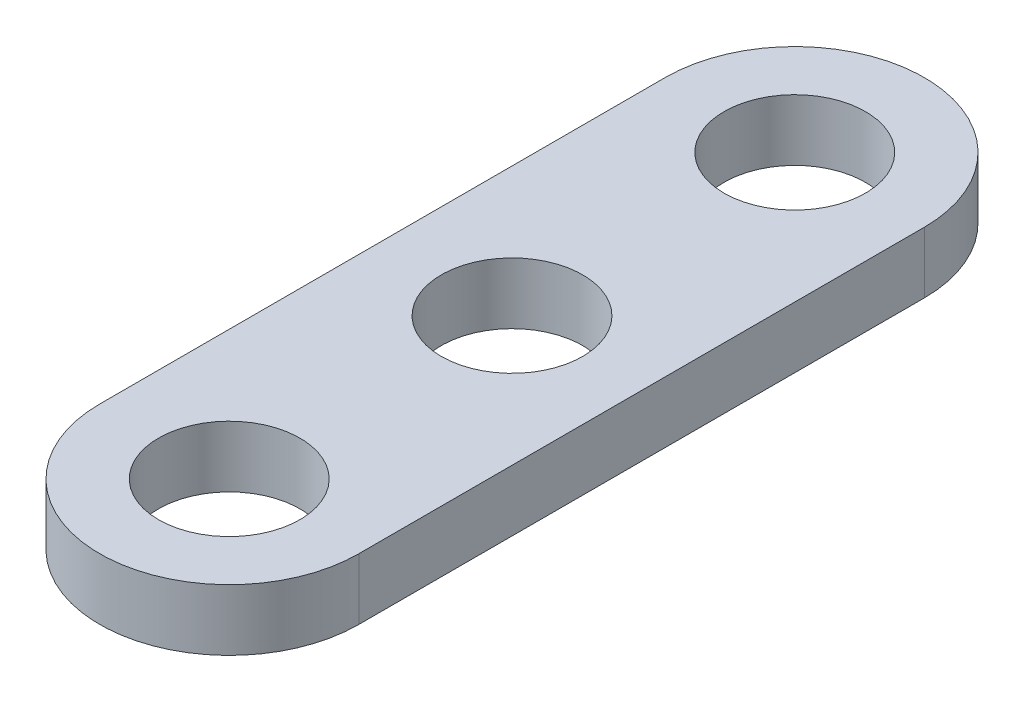
ISO-10303-21;
HEADER;
FILE_DESCRIPTION(('STEP AP214'),'2;1');
FILE_NAME('part.step','',(''),(''),'','','');
FILE_SCHEMA(('AUTOMOTIVE_DESIGN { 1 0 10303 214 1 1 1 1 }'));
ENDSEC;
DATA;
#1=APPLICATION_CONTEXT('core data for automotive mechanical design processes');
#2=APPLICATION_PROTOCOL_DEFINITION('international standard','automotive_design',2000,#1);
#3=PRODUCT_CONTEXT('',#1,'mechanical');
#4=PRODUCT('Part','Part','',(#3));
#5=PRODUCT_RELATED_PRODUCT_CATEGORY('part','',(#4));
#6=PRODUCT_DEFINITION_FORMATION('','',#4);
#7=PRODUCT_DEFINITION_CONTEXT('part definition',#1,'design');
#8=PRODUCT_DEFINITION('design','',#6,#7);
#9=PRODUCT_DEFINITION_SHAPE('','',#8);
#10=(LENGTH_UNIT() NAMED_UNIT(*) SI_UNIT(.MILLI.,.METRE.));
#11=(NAMED_UNIT(*) PLANE_ANGLE_UNIT() SI_UNIT($,.RADIAN.));
#12=(NAMED_UNIT(*) SI_UNIT($,.STERADIAN.) SOLID_ANGLE_UNIT());
#13=UNCERTAINTY_MEASURE_WITH_UNIT(LENGTH_MEASURE(1.E-05),#10,'distance_accuracy_value','');
#14=(GEOMETRIC_REPRESENTATION_CONTEXT(3) GLOBAL_UNCERTAINTY_ASSIGNED_CONTEXT((#13)) GLOBAL_UNIT_ASSIGNED_CONTEXT((#10,
#11,#12)) REPRESENTATION_CONTEXT('',''));
#15=CARTESIAN_POINT('',(0.,0.,0.));
#16=DIRECTION('',(0.,0.,1.));
#17=DIRECTION('',(1.,0.,0.));
#18=AXIS2_PLACEMENT_3D('',#15,#16,#17);
#19=CARTESIAN_POINT('',(0.,2.6,12.));
#20=DIRECTION('',(0.,1.,0.));
#21=DIRECTION('',(0.,0.,1.));
#22=AXIS2_PLACEMENT_3D('',#19,#20,#21);
#23=PLANE('',#22);
#24=CARTESIAN_POINT('',(0.,2.6,12.));
#25=DIRECTION('',(0.,1.,0.));
#26=DIRECTION('',(0.,0.,1.));
#27=AXIS2_PLACEMENT_3D('',#24,#25,#26);
#28=CIRCLE('',#27,3.);
#29=CARTESIAN_POINT('',(0.,2.6,15.));
#30=VERTEX_POINT('',#29);
#31=EDGE_CURVE('E136',#30,#30,#28,.T.);
#32=ORIENTED_EDGE('',*,*,#31,.F.);
#33=EDGE_LOOP('',(#32));
#34=FACE_BOUND('',#33,.T.);
#35=CARTESIAN_POINT('',(0.,2.6,12.));
#36=DIRECTION('',(0.,1.,0.));
#37=DIRECTION('',(0.,0.,1.));
#38=AXIS2_PLACEMENT_3D('',#35,#36,#37);
#39=CIRCLE('',#38,5.5);
#40=CARTESIAN_POINT('',(-5.5,2.6,12.));
#41=VERTEX_POINT('',#40);
#42=CARTESIAN_POINT('',(5.5,2.6,12.));
#43=VERTEX_POINT('',#42);
#44=EDGE_CURVE('E98',#41,#43,#39,.T.);
#45=ORIENTED_EDGE('',*,*,#44,.T.);
#46=DIRECTION('',(0.,0.,-1.));
#47=VECTOR('',#46,1.);
#48=CARTESIAN_POINT('',(5.5,2.6,12.));
#49=LINE('',#48,#47);
#50=CARTESIAN_POINT('',(5.49999999999999,2.6,-12.));
#51=VERTEX_POINT('',#50);
#52=EDGE_CURVE('E91',#43,#51,#49,.T.);
#53=ORIENTED_EDGE('',*,*,#52,.T.);
#54=CARTESIAN_POINT('',(0.,2.6,-12.));
#55=DIRECTION('',(0.,1.,0.));
#56=DIRECTION('',(0.,0.,1.));
#57=AXIS2_PLACEMENT_3D('',#54,#55,#56);
#58=CIRCLE('',#57,5.49999999999999);
#59=CARTESIAN_POINT('',(-5.49999999999999,2.6,-12.));
#60=VERTEX_POINT('',#59);
#61=EDGE_CURVE('E96',#51,#60,#58,.T.);
#62=ORIENTED_EDGE('',*,*,#61,.T.);
#63=DIRECTION('',(0.,0.,1.));
#64=VECTOR('',#63,1.);
#65=CARTESIAN_POINT('',(-5.5,2.6,12.));
#66=LINE('',#65,#64);
#67=EDGE_CURVE('E62',#60,#41,#66,.T.);
#68=ORIENTED_EDGE('',*,*,#67,.T.);
#69=EDGE_LOOP('',(#45,#53,#62,#68));
#70=FACE_BOUND('',#69,.T.);
#71=CARTESIAN_POINT('',(0.,2.6,-12.));
#72=DIRECTION('',(0.,1.,0.));
#73=DIRECTION('',(0.,0.,1.));
#74=AXIS2_PLACEMENT_3D('',#71,#72,#73);
#75=CIRCLE('',#74,3.);
#76=CARTESIAN_POINT('',(0.,2.6,-9.));
#77=VERTEX_POINT('',#76);
#78=EDGE_CURVE('E117',#77,#77,#75,.T.);
#79=ORIENTED_EDGE('',*,*,#78,.F.);
#80=EDGE_LOOP('',(#79));
#81=FACE_BOUND('',#80,.T.);
#82=CARTESIAN_POINT('',(0.,2.6,0.));
#83=DIRECTION('',(0.,1.,0.));
#84=DIRECTION('',(0.,0.,1.));
#85=AXIS2_PLACEMENT_3D('',#82,#83,#84);
#86=CIRCLE('',#85,3.);
#87=CARTESIAN_POINT('',(0.,2.6,3.));
#88=VERTEX_POINT('',#87);
#89=EDGE_CURVE('E146',#88,#88,#86,.T.);
#90=ORIENTED_EDGE('',*,*,#89,.F.);
#91=EDGE_LOOP('',(#90));
#92=FACE_BOUND('',#91,.T.);
#93=ADVANCED_FACE('F44',(#34,#70,#81,#92),#23,.T.);
#94=CARTESIAN_POINT('',(0.,0.,12.));
#95=DIRECTION('',(0.,1.,0.));
#96=DIRECTION('',(0.,0.,1.));
#97=AXIS2_PLACEMENT_3D('',#94,#95,#96);
#98=PLANE('',#97);
#99=CARTESIAN_POINT('',(0.,0.,12.));
#100=DIRECTION('',(0.,1.,0.));
#101=DIRECTION('',(0.,0.,1.));
#102=AXIS2_PLACEMENT_3D('',#99,#100,#101);
#103=CIRCLE('',#102,5.5);
#104=CARTESIAN_POINT('',(-5.5,0.,12.));
#105=VERTEX_POINT('',#104);
#106=CARTESIAN_POINT('',(5.5,0.,12.));
#107=VERTEX_POINT('',#106);
#108=EDGE_CURVE('E111',#105,#107,#103,.T.);
#109=ORIENTED_EDGE('',*,*,#108,.F.);
#110=DIRECTION('',(0.,0.,1.));
#111=VECTOR('',#110,1.);
#112=CARTESIAN_POINT('',(-5.5,0.,12.));
#113=LINE('',#112,#111);
#114=CARTESIAN_POINT('',(-5.49999999999999,0.,-12.));
#115=VERTEX_POINT('',#114);
#116=EDGE_CURVE('E88',#115,#105,#113,.T.);
#117=ORIENTED_EDGE('',*,*,#116,.F.);
#118=CARTESIAN_POINT('',(0.,0.,-12.));
#119=DIRECTION('',(0.,1.,0.));
#120=DIRECTION('',(0.,0.,1.));
#121=AXIS2_PLACEMENT_3D('',#118,#119,#120);
#122=CIRCLE('',#121,5.49999999999999);
#123=CARTESIAN_POINT('',(5.49999999999999,0.,-12.));
#124=VERTEX_POINT('',#123);
#125=EDGE_CURVE('E79',#124,#115,#122,.T.);
#126=ORIENTED_EDGE('',*,*,#125,.F.);
#127=DIRECTION('',(0.,0.,-1.));
#128=VECTOR('',#127,1.);
#129=CARTESIAN_POINT('',(5.5,0.,12.));
#130=LINE('',#129,#128);
#131=EDGE_CURVE('E103',#107,#124,#130,.T.);
#132=ORIENTED_EDGE('',*,*,#131,.F.);
#133=EDGE_LOOP('',(#109,#117,#126,#132));
#134=FACE_BOUND('',#133,.T.);
#135=CARTESIAN_POINT('',(0.,0.,-12.));
#136=DIRECTION('',(0.,1.,0.));
#137=DIRECTION('',(0.,0.,1.));
#138=AXIS2_PLACEMENT_3D('',#135,#136,#137);
#139=CIRCLE('',#138,3.);
#140=CARTESIAN_POINT('',(0.,0.,-9.));
#141=VERTEX_POINT('',#140);
#142=EDGE_CURVE('E137',#141,#141,#139,.T.);
#143=ORIENTED_EDGE('',*,*,#142,.T.);
#144=EDGE_LOOP('',(#143));
#145=FACE_BOUND('',#144,.T.);
#146=CARTESIAN_POINT('',(0.,0.,12.));
#147=DIRECTION('',(0.,1.,0.));
#148=DIRECTION('',(0.,0.,1.));
#149=AXIS2_PLACEMENT_3D('',#146,#147,#148);
#150=CIRCLE('',#149,3.);
#151=CARTESIAN_POINT('',(0.,0.,15.));
#152=VERTEX_POINT('',#151);
#153=EDGE_CURVE('E145',#152,#152,#150,.T.);
#154=ORIENTED_EDGE('',*,*,#153,.T.);
#155=EDGE_LOOP('',(#154));
#156=FACE_BOUND('',#155,.T.);
#157=CARTESIAN_POINT('',(0.,0.,0.));
#158=DIRECTION('',(0.,1.,0.));
#159=DIRECTION('',(0.,0.,1.));
#160=AXIS2_PLACEMENT_3D('',#157,#158,#159);
#161=CIRCLE('',#160,3.);
#162=CARTESIAN_POINT('',(0.,0.,3.));
#163=VERTEX_POINT('',#162);
#164=EDGE_CURVE('E155',#163,#163,#161,.T.);
#165=ORIENTED_EDGE('',*,*,#164,.T.);
#166=EDGE_LOOP('',(#165));
#167=FACE_BOUND('',#166,.T.);
#168=ADVANCED_FACE('F131',(#134,#145,#156,#167),#98,.F.);
#169=CARTESIAN_POINT('',(0.,2.6,12.));
#170=DIRECTION('',(0.,-1.,0.));
#171=DIRECTION('',(0.,0.,-1.));
#172=AXIS2_PLACEMENT_3D('',#169,#170,#171);
#173=CYLINDRICAL_SURFACE('',#172,5.5);
#174=ORIENTED_EDGE('',*,*,#108,.T.);
#175=DIRECTION('',(0.,-1.,0.));
#176=VECTOR('',#175,1.);
#177=CARTESIAN_POINT('',(5.5,2.6,12.));
#178=LINE('',#177,#176);
#179=EDGE_CURVE('E11',#43,#107,#178,.T.);
#180=ORIENTED_EDGE('',*,*,#179,.F.);
#181=ORIENTED_EDGE('',*,*,#44,.F.);
#182=DIRECTION('',(0.,-1.,0.));
#183=VECTOR('',#182,1.);
#184=CARTESIAN_POINT('',(-5.5,2.6,12.));
#185=LINE('',#184,#183);
#186=EDGE_CURVE('E109',#41,#105,#185,.T.);
#187=ORIENTED_EDGE('',*,*,#186,.T.);
#188=EDGE_LOOP('',(#174,#180,#181,#187));
#189=FACE_BOUND('',#188,.T.);
#190=ADVANCED_FACE('F50',(#189),#173,.T.);
#191=CARTESIAN_POINT('',(5.5,2.6,12.));
#192=DIRECTION('',(-1.,0.,0.));
#193=DIRECTION('',(0.,0.,1.));
#194=AXIS2_PLACEMENT_3D('',#191,#192,#193);
#195=PLANE('',#194);
#196=ORIENTED_EDGE('',*,*,#131,.T.);
#197=DIRECTION('',(0.,-1.,0.));
#198=VECTOR('',#197,1.);
#199=CARTESIAN_POINT('',(5.49999999999999,2.6,-12.));
#200=LINE('',#199,#198);
#201=EDGE_CURVE('E54',#51,#124,#200,.T.);
#202=ORIENTED_EDGE('',*,*,#201,.F.);
#203=ORIENTED_EDGE('',*,*,#52,.F.);
#204=ORIENTED_EDGE('',*,*,#179,.T.);
#205=EDGE_LOOP('',(#196,#202,#203,#204));
#206=FACE_BOUND('',#205,.T.);
#207=ADVANCED_FACE('F105',(#206),#195,.F.);
#208=CARTESIAN_POINT('',(0.,2.6,-12.));
#209=DIRECTION('',(0.,-1.,0.));
#210=DIRECTION('',(0.,0.,-1.));
#211=AXIS2_PLACEMENT_3D('',#208,#209,#210);
#212=CYLINDRICAL_SURFACE('',#211,5.49999999999999);
#213=ORIENTED_EDGE('',*,*,#125,.T.);
#214=DIRECTION('',(0.,-1.,0.));
#215=VECTOR('',#214,1.);
#216=CARTESIAN_POINT('',(-5.49999999999999,2.6,-12.));
#217=LINE('',#216,#215);
#218=EDGE_CURVE('E104',#60,#115,#217,.T.);
#219=ORIENTED_EDGE('',*,*,#218,.F.);
#220=ORIENTED_EDGE('',*,*,#61,.F.);
#221=ORIENTED_EDGE('',*,*,#201,.T.);
#222=EDGE_LOOP('',(#213,#219,#220,#221));
#223=FACE_BOUND('',#222,.T.);
#224=ADVANCED_FACE('F106',(#223),#212,.T.);
#225=CARTESIAN_POINT('',(-5.5,2.6,12.));
#226=DIRECTION('',(1.,0.,0.));
#227=DIRECTION('',(0.,0.,-1.));
#228=AXIS2_PLACEMENT_3D('',#225,#226,#227);
#229=PLANE('',#228);
#230=ORIENTED_EDGE('',*,*,#116,.T.);
#231=ORIENTED_EDGE('',*,*,#186,.F.);
#232=ORIENTED_EDGE('',*,*,#67,.F.);
#233=ORIENTED_EDGE('',*,*,#218,.T.);
#234=EDGE_LOOP('',(#230,#231,#232,#233));
#235=FACE_BOUND('',#234,.T.);
#236=ADVANCED_FACE('F126',(#235),#229,.F.);
#237=CARTESIAN_POINT('',(0.,2.6,-12.));
#238=DIRECTION('',(0.,-1.,0.));
#239=DIRECTION('',(0.,0.,-1.));
#240=AXIS2_PLACEMENT_3D('',#237,#238,#239);
#241=CYLINDRICAL_SURFACE('',#240,3.);
#242=ORIENTED_EDGE('',*,*,#78,.T.);
#243=EDGE_LOOP('',(#242));
#244=FACE_BOUND('',#243,.T.);
#245=ORIENTED_EDGE('',*,*,#142,.F.);
#246=EDGE_LOOP('',(#245));
#247=FACE_BOUND('',#246,.T.);
#248=ADVANCED_FACE('F175',(#244,#247),#241,.F.);
#249=CARTESIAN_POINT('',(0.,2.6,12.));
#250=DIRECTION('',(0.,-1.,0.));
#251=DIRECTION('',(0.,0.,-1.));
#252=AXIS2_PLACEMENT_3D('',#249,#250,#251);
#253=CYLINDRICAL_SURFACE('',#252,3.);
#254=ORIENTED_EDGE('',*,*,#31,.T.);
#255=EDGE_LOOP('',(#254));
#256=FACE_BOUND('',#255,.T.);
#257=ORIENTED_EDGE('',*,*,#153,.F.);
#258=EDGE_LOOP('',(#257));
#259=FACE_BOUND('',#258,.T.);
#260=ADVANCED_FACE('F220',(#256,#259),#253,.F.);
#261=CARTESIAN_POINT('',(0.,2.6,0.));
#262=DIRECTION('',(0.,-1.,0.));
#263=DIRECTION('',(0.,0.,-1.));
#264=AXIS2_PLACEMENT_3D('',#261,#262,#263);
#265=CYLINDRICAL_SURFACE('',#264,3.);
#266=ORIENTED_EDGE('',*,*,#89,.T.);
#267=EDGE_LOOP('',(#266));
#268=FACE_BOUND('',#267,.T.);
#269=ORIENTED_EDGE('',*,*,#164,.F.);
#270=EDGE_LOOP('',(#269));
#271=FACE_BOUND('',#270,.T.);
#272=ADVANCED_FACE('F159',(#268,#271),#265,.F.);
#273=CLOSED_SHELL('',(#93,#168,#190,#207,#224,#236,#248,#260,#272));
#274=MANIFOLD_SOLID_BREP('B2',#273);
#275=ADVANCED_BREP_SHAPE_REPRESENTATION('',(#18,#274),#14);
#276=SHAPE_DEFINITION_REPRESENTATION(#9,#275);
ENDSEC;
END-ISO-10303-21;
